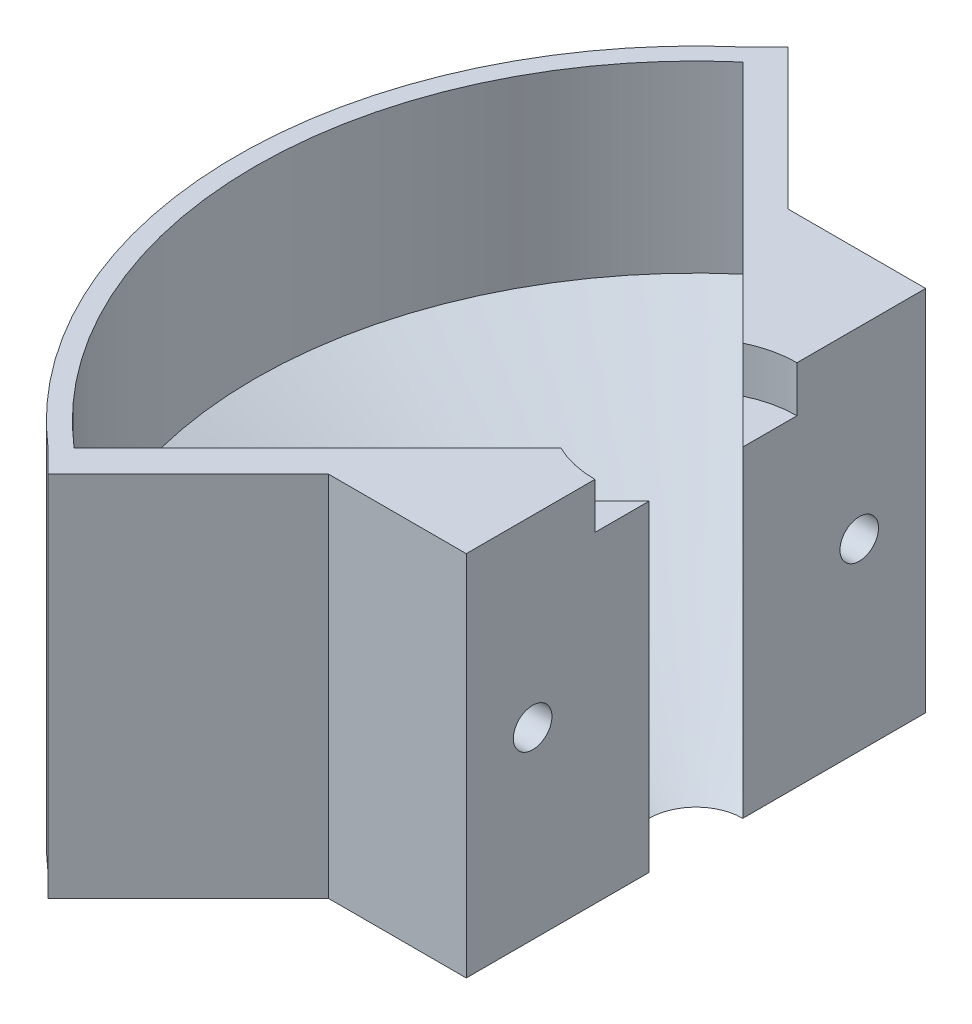
ISO-10303-21;
HEADER;
FILE_DESCRIPTION(('STEP AP214'),'2;1');
FILE_NAME('part.step','',(''),(''),'','','');
FILE_SCHEMA(('AUTOMOTIVE_DESIGN { 1 0 10303 214 1 1 1 1 }'));
ENDSEC;
DATA;
#1=APPLICATION_CONTEXT('core data for automotive mechanical design processes');
#2=APPLICATION_PROTOCOL_DEFINITION('international standard','automotive_design',2000,#1);
#3=PRODUCT_CONTEXT('',#1,'mechanical');
#4=PRODUCT('Part','Part','',(#3));
#5=PRODUCT_RELATED_PRODUCT_CATEGORY('part','',(#4));
#6=PRODUCT_DEFINITION_FORMATION('','',#4);
#7=PRODUCT_DEFINITION_CONTEXT('part definition',#1,'design');
#8=PRODUCT_DEFINITION('design','',#6,#7);
#9=PRODUCT_DEFINITION_SHAPE('','',#8);
#10=(LENGTH_UNIT() NAMED_UNIT(*) SI_UNIT(.MILLI.,.METRE.));
#11=(NAMED_UNIT(*) PLANE_ANGLE_UNIT() SI_UNIT($,.RADIAN.));
#12=(NAMED_UNIT(*) SI_UNIT($,.STERADIAN.) SOLID_ANGLE_UNIT());
#13=UNCERTAINTY_MEASURE_WITH_UNIT(LENGTH_MEASURE(1.E-05),#10,'distance_accuracy_value','');
#14=(GEOMETRIC_REPRESENTATION_CONTEXT(3) GLOBAL_UNCERTAINTY_ASSIGNED_CONTEXT((#13)) GLOBAL_UNIT_ASSIGNED_CONTEXT((#10,
#11,#12)) REPRESENTATION_CONTEXT('',''));
#15=CARTESIAN_POINT('',(0.,0.,0.));
#16=DIRECTION('',(0.,0.,1.));
#17=DIRECTION('',(1.,0.,0.));
#18=AXIS2_PLACEMENT_3D('',#15,#16,#17);
#19=CARTESIAN_POINT('',(0.,0.,0.));
#20=DIRECTION('',(0.,1.,0.));
#21=DIRECTION('',(0.,0.,1.));
#22=AXIS2_PLACEMENT_3D('',#19,#20,#21);
#23=PLANE('',#22);
#24=DIRECTION('',(-0.707106781186546,0.,-0.707106781186549));
#25=VECTOR('',#24,1.);
#26=CARTESIAN_POINT('',(6.34999999999996,0.,-6.34999999999993));
#27=LINE('',#26,#25);
#28=CARTESIAN_POINT('',(-19.05,0.,-31.75));
#29=VERTEX_POINT('',#28);
#30=CARTESIAN_POINT('',(-38.43434009506,0.,-51.13434009506));
#31=VERTEX_POINT('',#30);
#32=EDGE_CURVE('E295',#29,#31,#27,.T.);
#33=ORIENTED_EDGE('',*,*,#32,.F.);
#34=DIRECTION('',(1.,0.,0.));
#35=VECTOR('',#34,1.);
#36=CARTESIAN_POINT('',(0.,0.,-31.75));
#37=LINE('',#36,#35);
#38=CARTESIAN_POINT('',(1.10854532508269E-13,0.,-31.75));
#39=VERTEX_POINT('',#38);
#40=EDGE_CURVE('E267',#29,#39,#37,.T.);
#41=ORIENTED_EDGE('',*,*,#40,.T.);
#42=DIRECTION('',(0.,0.,1.));
#43=VECTOR('',#42,1.);
#44=CARTESIAN_POINT('',(0.,0.,0.));
#45=LINE('',#44,#43);
#46=CARTESIAN_POINT('',(0.,0.,-6.477));
#47=VERTEX_POINT('',#46);
#48=EDGE_CURVE('E228',#39,#47,#45,.T.);
#49=ORIENTED_EDGE('',*,*,#48,.T.);
#50=CARTESIAN_POINT('',(0.,0.,0.));
#51=DIRECTION('',(0.,-1.,0.));
#52=DIRECTION('',(0.,0.,-1.));
#53=AXIS2_PLACEMENT_3D('',#50,#51,#52);
#54=CIRCLE('',#53,6.477);
#55=CARTESIAN_POINT('',(0.,0.,6.477));
#56=VERTEX_POINT('',#55);
#57=EDGE_CURVE('E245',#56,#47,#54,.T.);
#58=ORIENTED_EDGE('',*,*,#57,.F.);
#59=DIRECTION('',(0.,0.,-1.));
#60=VECTOR('',#59,1.);
#61=CARTESIAN_POINT('',(0.,0.,0.));
#62=LINE('',#61,#60);
#63=CARTESIAN_POINT('',(1.10854532508269E-13,0.,31.75));
#64=VERTEX_POINT('',#63);
#65=EDGE_CURVE('E234',#64,#56,#62,.T.);
#66=ORIENTED_EDGE('',*,*,#65,.F.);
#67=DIRECTION('',(1.,0.,0.));
#68=VECTOR('',#67,1.);
#69=CARTESIAN_POINT('',(0.,0.,31.75));
#70=LINE('',#69,#68);
#71=CARTESIAN_POINT('',(-19.05,0.,31.75));
#72=VERTEX_POINT('',#71);
#73=EDGE_CURVE('E275',#72,#64,#70,.T.);
#74=ORIENTED_EDGE('',*,*,#73,.F.);
#75=DIRECTION('',(-0.707106781186551,0.,0.707106781186544));
#76=VECTOR('',#75,1.);
#77=CARTESIAN_POINT('',(6.35000000000011,0.,6.35000000000018));
#78=LINE('',#77,#76);
#79=CARTESIAN_POINT('',(-38.4343400950601,0.,51.1343400950599));
#80=VERTEX_POINT('',#79);
#81=EDGE_CURVE('E282',#72,#80,#78,.T.);
#82=ORIENTED_EDGE('',*,*,#81,.T.);
#83=DIRECTION('',(0.707106781186543,0.,0.707106781186552));
#84=VECTOR('',#83,1.);
#85=CARTESIAN_POINT('',(-44.7843400950603,0.,44.7843400950597));
#86=LINE('',#85,#84);
#87=CARTESIAN_POINT('',(-41.5458400950599,0.,48.0228400950601));
#88=VERTEX_POINT('',#87);
#89=EDGE_CURVE('E286',#88,#80,#86,.T.);
#90=ORIENTED_EDGE('',*,*,#89,.F.);
#91=CARTESIAN_POINT('',(0.,0.,0.));
#92=DIRECTION('',(0.,-1.,0.));
#93=DIRECTION('',(0.,0.,-1.));
#94=AXIS2_PLACEMENT_3D('',#91,#92,#93);
#95=CIRCLE('',#94,63.5);
#96=CARTESIAN_POINT('',(-41.5458400950599,0.,-48.0228400950601));
#97=VERTEX_POINT('',#96);
#98=EDGE_CURVE('E248',#88,#97,#95,.T.);
#99=ORIENTED_EDGE('',*,*,#98,.T.);
#100=DIRECTION('',(0.707106781186551,0.,-0.707106781186544));
#101=VECTOR('',#100,1.);
#102=CARTESIAN_POINT('',(-44.7843400950598,0.,-44.7843400950602));
#103=LINE('',#102,#101);
#104=EDGE_CURVE('E299',#97,#31,#103,.T.);
#105=ORIENTED_EDGE('',*,*,#104,.T.);
#106=EDGE_LOOP('',(#33,#41,#49,#58,#66,#74,#82,#90,#99,#105));
#107=FACE_BOUND('',#106,.T.);
#108=ADVANCED_FACE('F39',(#107),#23,.F.);
#109=CARTESIAN_POINT('',(0.,0.,0.));
#110=DIRECTION('',(0.,1.,0.));
#111=DIRECTION('',(0.,0.,1.));
#112=AXIS2_PLACEMENT_3D('',#109,#110,#111);
#113=CONICAL_SURFACE('',#112,6.477,1.13446401379632);
#114=CARTESIAN_POINT('',(0.,25.4058401392584,0.));
#115=DIRECTION('',(0.,-1.,0.));
#116=DIRECTION('',(0.,0.,-1.));
#117=AXIS2_PLACEMENT_3D('',#114,#115,#116);
#118=CIRCLE('',#117,60.96);
#119=CARTESIAN_POINT('',(-39.7449028172502,25.4058401392584,46.2219028172503));
#120=VERTEX_POINT('',#119);
#121=CARTESIAN_POINT('',(-39.7449028172502,25.4058401392584,-46.2219028172504));
#122=VERTEX_POINT('',#121);
#123=EDGE_CURVE('E242',#120,#122,#118,.T.);
#124=ORIENTED_EDGE('',*,*,#123,.F.);
#125=CARTESIAN_POINT('',(22.2185306471337,9.67716288061729,-15.7415306471337));
#126=CARTESIAN_POINT('',(21.7337843131844,9.36205880585059,-15.2567843131845));
#127=CARTESIAN_POINT('',(21.2489522906724,9.04721783375823,-14.7719522906724));
#128=CARTESIAN_POINT('',(20.2790528091265,8.41825083263591,-13.8020528091265));
#129=CARTESIAN_POINT('',(19.7939853486475,8.10412480806348,-13.3169853486475));
#130=CARTESIAN_POINT('',(18.8228502714689,7.47632351718254,-12.3458502714689));
#131=CARTESIAN_POINT('',(18.3367822270367,7.16264957371029,-11.8597822270367));
#132=CARTESIAN_POINT('',(17.3642613779835,6.53650532118089,-10.8872613779835));
#133=CARTESIAN_POINT('',(16.8778085752714,6.22403500619693,-10.4008085752715));
#134=CARTESIAN_POINT('',(15.834231981346,5.55579562103315,-9.35723198134598));
#135=CARTESIAN_POINT('',(15.2770279164825,5.2002771442845,-8.8000279164825));
#136=CARTESIAN_POINT('',(14.161626219843,4.49232873829381,-7.68462621984304));
#137=CARTESIAN_POINT('',(13.603428571678,4.13989886057682,-7.12642857167796));
#138=CARTESIAN_POINT('',(12.7653961675281,3.61514032547954,-6.28839616752813));
#139=CARTESIAN_POINT('',(12.4861311131338,3.44099276528883,-6.00913111313377));
#140=CARTESIAN_POINT('',(11.927117307022,3.09425815849328,-5.45011730702203));
#141=CARTESIAN_POINT('',(11.6473685563993,2.92167110836224,-5.17036855639934));
#142=CARTESIAN_POINT('',(11.0872588734185,2.5785309350132,-4.61025887341849));
#143=CARTESIAN_POINT('',(10.8068979626271,2.40797774146662,-4.32989796262711));
#144=CARTESIAN_POINT('',(10.2453582682314,2.06957155299808,-3.76835826823144));
#145=CARTESIAN_POINT('',(9.96417947861359,1.90171857798934,-3.48717947861359));
#146=CARTESIAN_POINT('',(9.43213700430225,1.58822251276637,-2.95513700430225));
#147=CARTESIAN_POINT('',(9.18138838161661,1.442189580832,-2.70438838161661));
#148=CARTESIAN_POINT('',(8.67875578548658,1.15409207819818,-2.20175578548658));
#149=CARTESIAN_POINT('',(8.42687183720714,1.01202742003787,-1.94987183720713));
#150=CARTESIAN_POINT('',(7.92063748871871,0.732903513769204,-1.4436374887187));
#151=CARTESIAN_POINT('',(7.66628140160357,0.595864824933706,-1.18928140160356));
#152=CARTESIAN_POINT('',(7.15547556796822,0.329744557820167,-0.67847556796821));
#153=CARTESIAN_POINT('',(6.89902586493743,0.200662814731159,-0.422025864937417));
#154=CARTESIAN_POINT('',(6.51878119456729,0.0190416438477024,-0.0417811945672852));
#155=CARTESIAN_POINT('',(6.39608193390751,-0.0380803780612059,0.0809180660925016));
#156=CARTESIAN_POINT('',(6.14995084788253,-0.14906562916283,0.327049152117482));
#157=CARTESIAN_POINT('',(6.0265190468542,-0.202928965959242,0.450480953145808));
#158=CARTESIAN_POINT('',(5.77877611059957,-0.306721804471863,0.698223889400437));
#159=CARTESIAN_POINT('',(5.65446468420135,-0.356649930131262,0.822535315798663));
#160=CARTESIAN_POINT('',(5.40492927003386,-0.451692183262391,1.07207072996615));
#161=CARTESIAN_POINT('',(5.27970524720857,-0.496806124751976,1.19729475279144));
#162=CARTESIAN_POINT('',(4.9041750825522,-0.622878424826763,1.57282491744782));
#163=CARTESIAN_POINT('',(4.65233766127113,-0.695294767701955,1.82466233872888));
#164=CARTESIAN_POINT('',(4.27202091008192,-0.779877351723351,2.20497908991809));
#165=CARTESIAN_POINT('',(4.14486520300339,-0.804060450996301,2.33213479699663));
#166=CARTESIAN_POINT('',(3.88986284151042,-0.843383461244161,2.5871371584896));
#167=CARTESIAN_POINT('',(3.76201628489703,-0.858524620076481,2.71498371510298));
#168=CARTESIAN_POINT('',(3.46622173643085,-0.882153535188674,3.01077826356917));
#169=CARTESIAN_POINT('',(3.2981247431039,-0.887125150509718,3.17887525689612));
#170=CARTESIAN_POINT('',(2.96211957868032,-0.879719678600552,3.5148804213197));
#171=CARTESIAN_POINT('',(2.79421142403984,-0.867341181382737,3.68278857596018));
#172=CARTESIAN_POINT('',(2.45898595132387,-0.826319272528589,4.01801404867615));
#173=CARTESIAN_POINT('',(2.29167123619301,-0.797634415617515,4.18532876380701));
#174=CARTESIAN_POINT('',(1.95856281756555,-0.726224465865842,4.51843718243447));
#175=CARTESIAN_POINT('',(1.79276929077618,-0.68349776257357,4.68423070922384));
#176=CARTESIAN_POINT('',(1.45990781351204,-0.58575216763616,5.01709218648798));
#177=CARTESIAN_POINT('',(1.29287094809667,-0.53052515720236,5.18412905190336));
#178=CARTESIAN_POINT('',(0.960493629975765,-0.410800213728523,5.51650637002426));
#179=CARTESIAN_POINT('',(0.795153144495257,-0.346302460167047,5.68184685550477));
#180=CARTESIAN_POINT('',(0.46600201922674,-0.210160940631327,6.01099798077328));
#181=CARTESIAN_POINT('',(0.30219104888289,-0.138518759712606,6.17480895111713));
#182=CARTESIAN_POINT('',(0.0574312354014305,-0.0269119644369387,6.41956876459859));
#183=CARTESIAN_POINT('',(-0.0239953909176357,0.0109806224410036,6.50099539091766));
#184=CARTESIAN_POINT('',(-0.186559095418323,0.0879876698378885,6.66355909541835));
#185=CARTESIAN_POINT('',(-0.267696174855889,0.12710212504963,6.74469617485591));
#186=CARTESIAN_POINT('',(-0.504489189724358,0.243008311240306,6.98148918972438));
#187=CARTESIAN_POINT('',(-0.659790891518045,0.321247874622927,7.13679089151807));
#188=CARTESIAN_POINT('',(-0.969589430218108,0.480858272288594,7.44658943021813));
#189=CARTESIAN_POINT('',(-1.12408624065079,0.562229208836623,7.60108624065082));
#190=CARTESIAN_POINT('',(-1.43242609434515,0.727479115220677,7.90942609434518));
#191=CARTESIAN_POINT('',(-1.58626906313016,0.811358362463788,8.06326906313019));
#192=CARTESIAN_POINT('',(-1.89339719757366,0.981137436946703,8.37039719757369));
#193=CARTESIAN_POINT('',(-2.04668235706383,1.06703728645261,8.52368235706386));
#194=CARTESIAN_POINT('',(-2.50595370379375,1.32725045864989,8.98295370379378));
#195=CARTESIAN_POINT('',(-2.8112445621671,1.50401714260153,9.28824456216713));
#196=CARTESIAN_POINT('',(-3.42051670784652,1.86200767199346,9.89751670784655));
#197=CARTESIAN_POINT('',(-3.72449796951653,2.04323160422508,10.2014979695166));
#198=CARTESIAN_POINT('',(-4.3316899189757,2.40897190067935,10.8086899189757));
#199=CARTESIAN_POINT('',(-4.63490001196786,2.59349023705738,11.1119000119679));
#200=CARTESIAN_POINT('',(-5.24060829747395,2.96486178559192,11.717608297474));
#201=CARTESIAN_POINT('',(-5.54310647980282,3.15171503091475,12.0201064798029));
#202=CARTESIAN_POINT('',(-6.14748242199471,3.52713178953416,12.6244824219948));
#203=CARTESIAN_POINT('',(-6.44936031627085,3.71569487043352,12.9263603162709));
#204=CARTESIAN_POINT('',(-7.0526907251003,4.09417662104561,13.5296907251003));
#205=CARTESIAN_POINT('',(-7.35414323947282,4.28409529133428,13.8311432394729));
#206=CARTESIAN_POINT('',(-8.25452965918542,4.85323702628278,14.7315296591855));
#207=CARTESIAN_POINT('',(-8.85297166247992,5.23401601623761,15.32997166248));
#208=CARTESIAN_POINT('',(-10.0490333942426,5.99828382373224,16.5260333942426));
#209=CARTESIAN_POINT('',(-10.6466530689204,6.38177280932843,17.1236530689204));
#210=CARTESIAN_POINT('',(-11.8410101757164,7.15041885951564,18.3180101757164));
#211=CARTESIAN_POINT('',(-12.4377478932615,7.53557503742941,18.9147478932616));
#212=CARTESIAN_POINT('',(-13.630783791836,8.30720420989987,20.1077837918361));
#213=CARTESIAN_POINT('',(-14.2270819808565,8.69367717975958,20.7040819808566));
#214=CARTESIAN_POINT('',(-15.9258952834684,9.79637914220122,22.4028952834685));
#215=CARTESIAN_POINT('',(-17.0280306271886,10.5137780361381,23.5050306271886));
#216=CARTESIAN_POINT('',(-19.2316552361762,11.9505821597325,25.7086552361763));
#217=CARTESIAN_POINT('',(-20.3331444972632,12.6699874022025,26.8101444972633));
#218=CARTESIAN_POINT('',(-22.5358562090287,14.110230920228,29.0128562090287));
#219=CARTESIAN_POINT('',(-23.637078594346,14.8310693956823,30.1140785943461));
#220=CARTESIAN_POINT('',(-25.8392210437084,16.2736617357618,32.3162210437085));
#221=CARTESIAN_POINT('',(-26.9401411082972,16.9954155987273,33.4171411082972));
#222=CARTESIAN_POINT('',(-30.2462168402928,19.1640334667112,36.7232168402929));
#223=CARTESIAN_POINT('',(-32.4510521952293,20.6118740225196,38.9280521952294));
#224=CARTESIAN_POINT('',(-36.860152139453,23.5089459097632,43.3371521394531));
#225=CARTESIAN_POINT('',(-39.0644167489798,24.9581771796156,45.5414167489799));
#226=CARTESIAN_POINT('',(-43.3293073547119,27.7632805365026,49.806307354712));
#227=CARTESIAN_POINT('',(-45.3899523155634,29.1190949576445,51.8669523155635));
#228=CARTESIAN_POINT('',(-49.5110915881632,31.8312872437933,55.9880915881634));
#229=CARTESIAN_POINT('',(-51.5715858974255,33.1876651163548,58.0485858974257));
#230=CARTESIAN_POINT('',(-55.6891490831567,35.8986349701795,62.1661490831568));
#231=CARTESIAN_POINT('',(-57.7462181627681,37.2532263343772,64.2232181627682));
#232=CARTESIAN_POINT('',(-61.860232360352,39.9626798216561,68.3372323603522));
#233=CARTESIAN_POINT('',(-63.9171774796504,41.3175419407107,70.3941774796506));
#234=CARTESIAN_POINT('',(-65.9740905347648,42.6725013844159,72.451090534765));
#235=B_SPLINE_CURVE_WITH_KNOTS('',3,(#125,#126,#127,#128,#129,#130,#131,#132,#133,#134,#135,
#136,#137,#138,#139,#140,#141,#142,#143,#144,#145,#146,#147,#148,#149,#150,#151,#152,#153,#154,
#155,#156,#157,#158,#159,#160,#161,#162,#163,#164,#165,#166,#167,#168,#169,#170,#171,#172,#173,
#174,#175,#176,#177,#178,#179,#180,#181,#182,#183,#184,#185,#186,#187,#188,#189,#190,#191,#192,
#193,#194,#195,#196,#197,#198,#199,#200,#201,#202,#203,#204,#205,#206,#207,#208,#209,#210,#211,
#212,#213,#214,#215,#216,#217,#218,#219,#220,#221,#222,#223,#224,#225,#226,#227,#228,#229,#230,
#231,#232,#233,#234),.UNSPECIFIED.,.F.,.F.,(4,2,2,2,2,2,2,2,2,2,2,2,2,2,2,2,2,2,2,2,2,2,2,2,2,2,
2,2,2,2,2,2,2,2,2,2,2,2,2,2,2,2,2,2,2,2,2,2,2,2,2,2,2,2,4),(0.,2.26345723044833,
4.52692853458373,6.79369645594403,9.06045320113847,11.6539250782194,14.2474401384273,
15.5423306588726,16.8372182526029,18.1320609399129,19.4269131718843,20.5774089246282,
21.7278793003748,22.8826243394744,24.037345452479,24.5853692946725,25.1333750309086,
25.6815715502965,26.2297892400176,27.3188076570233,27.8629499758512,28.4070171814836,
29.1196950459244,29.8324308307514,30.5469863016951,31.2616237532308,31.9891713975376,
32.7167049586559,33.4440774674887,33.807758889203,34.1714387314818,34.8708535615927,
35.5702912527433,36.2698065865231,36.9693296322521,38.3688808864512,39.7684594142579,
41.1689059134475,42.5693723280062,43.9694939452173,45.3696161573316,48.1537276698885,
50.9380133772276,53.7209658503926,56.5038664123469,61.6513476855413,66.7988619062516,
71.9471530380146,77.0954348496736,87.4089960353167,97.7221198496211,107.364564079336,
117.007142058906,126.634283747688,136.261291581588),.UNSPECIFIED.);
#236=EDGE_CURVE('E186',#56,#120,#235,.T.);
#237=ORIENTED_EDGE('',*,*,#236,.F.);
#238=ORIENTED_EDGE('',*,*,#57,.T.);
#239=CARTESIAN_POINT('',(22.2185306471337,9.6771628806173,15.7415306471338));
#240=CARTESIAN_POINT('',(21.7337843131844,9.3620588058506,15.2567843131845));
#241=CARTESIAN_POINT('',(21.2489522906724,9.04721783375824,14.7719522906724));
#242=CARTESIAN_POINT('',(20.2790528091265,8.41825083263592,13.8020528091265));
#243=CARTESIAN_POINT('',(19.7939853486475,8.10412480806348,13.3169853486475));
#244=CARTESIAN_POINT('',(18.8228502714689,7.47632351718254,12.3458502714689));
#245=CARTESIAN_POINT('',(18.3367822270367,7.16264957371029,11.8597822270367));
#246=CARTESIAN_POINT('',(17.3642613779835,6.5365053211809,10.8872613779836));
#247=CARTESIAN_POINT('',(16.8778085752714,6.22403500619693,10.4008085752715));
#248=CARTESIAN_POINT('',(15.834231981346,5.55579562103315,9.357231981346));
#249=CARTESIAN_POINT('',(15.2770279164825,5.2002771442845,8.80002791648252));
#250=CARTESIAN_POINT('',(14.161626219843,4.49232873829381,7.68462621984306));
#251=CARTESIAN_POINT('',(13.6034285716779,4.13989886057682,7.12642857167797));
#252=CARTESIAN_POINT('',(12.7653961675281,3.61514032547954,6.28839616752814));
#253=CARTESIAN_POINT('',(12.4861311131338,3.44099276528883,6.00913111313378));
#254=CARTESIAN_POINT('',(11.927117307022,3.09425815849328,5.45011730702204));
#255=CARTESIAN_POINT('',(11.6473685563993,2.92167110836224,5.17036855639935));
#256=CARTESIAN_POINT('',(11.0872588734185,2.57853093501319,4.61025887341849));
#257=CARTESIAN_POINT('',(10.8068979626271,2.40797774146661,4.32989796262712));
#258=CARTESIAN_POINT('',(10.2453582682314,2.06957155299807,3.76835826823144));
#259=CARTESIAN_POINT('',(9.96417947861358,1.90171857798933,3.4871794786136));
#260=CARTESIAN_POINT('',(9.43213700430224,1.58822251276637,2.95513700430226));
#261=CARTESIAN_POINT('',(9.1813883816166,1.44218958083199,2.70438838161661));
#262=CARTESIAN_POINT('',(8.67875578548658,1.15409207819817,2.20175578548659));
#263=CARTESIAN_POINT('',(8.42687183720713,1.01202742003787,1.94987183720714));
#264=CARTESIAN_POINT('',(7.9206374887187,0.732903513769201,1.44363748871871));
#265=CARTESIAN_POINT('',(7.66628140160356,0.595864824933703,1.18928140160357));
#266=CARTESIAN_POINT('',(7.15547556796821,0.329744557820164,0.678475567968214));
#267=CARTESIAN_POINT('',(6.89902586493742,0.200662814731155,0.422025864937421));
#268=CARTESIAN_POINT('',(6.51878119456729,0.0190416438476983,0.0417811945672876));
#269=CARTESIAN_POINT('',(6.3960819339075,-0.0380803780612098,-0.0809180660924995));
#270=CARTESIAN_POINT('',(6.14995084788252,-0.149065629162833,-0.327049152117479));
#271=CARTESIAN_POINT('',(6.0265190468542,-0.202928965959245,-0.450480953145804));
#272=CARTESIAN_POINT('',(5.77877611059957,-0.306721804471866,-0.698223889400433));
#273=CARTESIAN_POINT('',(5.65446468420134,-0.356649930131265,-0.822535315798659));
#274=CARTESIAN_POINT('',(5.40492927003386,-0.451692183262394,-1.07207072996614));
#275=CARTESIAN_POINT('',(5.27970524720857,-0.496806124751979,-1.19729475279144));
#276=CARTESIAN_POINT('',(4.90417508255219,-0.622878424826767,-1.57282491744781));
#277=CARTESIAN_POINT('',(4.65233766127113,-0.695294767701957,-1.82466233872888));
#278=CARTESIAN_POINT('',(4.27202091008192,-0.779877351723353,-2.20497908991809));
#279=CARTESIAN_POINT('',(4.14486520300338,-0.804060450996304,-2.33213479699662));
#280=CARTESIAN_POINT('',(3.88986284151041,-0.843383461244163,-2.58713715848959));
#281=CARTESIAN_POINT('',(3.76201628489702,-0.858524620076483,-2.71498371510298));
#282=CARTESIAN_POINT('',(3.46622173643084,-0.882153535188676,-3.01077826356917));
#283=CARTESIAN_POINT('',(3.29812474310389,-0.88712515050972,-3.17887525689612));
#284=CARTESIAN_POINT('',(2.96211957868031,-0.879719678600553,-3.5148804213197));
#285=CARTESIAN_POINT('',(2.79421142403983,-0.867341181382738,-3.68278857596019));
#286=CARTESIAN_POINT('',(2.45898595132386,-0.82631927252859,-4.01801404867616));
#287=CARTESIAN_POINT('',(2.291671236193,-0.797634415617515,-4.18532876380701));
#288=CARTESIAN_POINT('',(1.95856281756554,-0.726224465865842,-4.51843718243448));
#289=CARTESIAN_POINT('',(1.79276929077617,-0.683497762573569,-4.68423070922384));
#290=CARTESIAN_POINT('',(1.45990781351203,-0.585752167636158,-5.01709218648798));
#291=CARTESIAN_POINT('',(1.29287094809665,-0.530525157202358,-5.18412905190336));
#292=CARTESIAN_POINT('',(0.960493629975753,-0.41080021372852,-5.51650637002427));
#293=CARTESIAN_POINT('',(0.795153144495244,-0.346302460167044,-5.68184685550477));
#294=CARTESIAN_POINT('',(0.466002019226727,-0.210160940631323,-6.01099798077329));
#295=CARTESIAN_POINT('',(0.302191048882876,-0.138518759712601,-6.17480895111715));
#296=CARTESIAN_POINT('',(0.0574312354014154,-0.0269119644369328,-6.41956876459861));
#297=CARTESIAN_POINT('',(-0.0239953909176508,0.0109806224410097,-6.50099539091767));
#298=CARTESIAN_POINT('',(-0.186559095418338,0.087987669837895,-6.66355909541836));
#299=CARTESIAN_POINT('',(-0.267696174855905,0.127102125049637,-6.74469617485593));
#300=CARTESIAN_POINT('',(-0.504489189724374,0.243008311240313,-6.9814891897244));
#301=CARTESIAN_POINT('',(-0.659790891518063,0.321247874622935,-7.13679089151809));
#302=CARTESIAN_POINT('',(-0.969589430218126,0.480858272288603,-7.44658943021815));
#303=CARTESIAN_POINT('',(-1.12408624065081,0.562229208836632,-7.60108624065083));
#304=CARTESIAN_POINT('',(-1.43242609434517,0.727479115220687,-7.9094260943452));
#305=CARTESIAN_POINT('',(-1.58626906313018,0.811358362463798,-8.06326906313021));
#306=CARTESIAN_POINT('',(-1.89339719757368,0.981137436946713,-8.37039719757371));
#307=CARTESIAN_POINT('',(-2.04668235706385,1.06703728645262,-8.52368235706388));
#308=CARTESIAN_POINT('',(-2.50595370379377,1.3272504586499,-8.9829537037938));
#309=CARTESIAN_POINT('',(-2.81124456216712,1.50401714260155,-9.28824456216715));
#310=CARTESIAN_POINT('',(-3.42051670784654,1.86200767199347,-9.89751670784657));
#311=CARTESIAN_POINT('',(-3.72449796951655,2.04323160422509,-10.2014979695166));
#312=CARTESIAN_POINT('',(-4.33168991897572,2.40897190067936,-10.8086899189758));
#313=CARTESIAN_POINT('',(-4.63490001196789,2.59349023705739,-11.1119000119679));
#314=CARTESIAN_POINT('',(-5.24060829747398,2.96486178559194,-11.717608297474));
#315=CARTESIAN_POINT('',(-5.54310647980284,3.15171503091477,-12.0201064798029));
#316=CARTESIAN_POINT('',(-6.14748242199474,3.52713178953418,-12.6244824219948));
#317=CARTESIAN_POINT('',(-6.44936031627087,3.71569487043354,-12.9263603162709));
#318=CARTESIAN_POINT('',(-7.05269072510032,4.09417662104563,-13.5296907251004));
#319=CARTESIAN_POINT('',(-7.35414323947285,4.2840952913343,-13.8311432394729));
#320=CARTESIAN_POINT('',(-8.25452965918545,4.8532370262828,-14.7315296591855));
#321=CARTESIAN_POINT('',(-8.85297166247995,5.23401601623764,-15.32997166248));
#322=CARTESIAN_POINT('',(-10.0490333942426,5.99828382373227,-16.5260333942427));
#323=CARTESIAN_POINT('',(-10.6466530689204,6.38177280932846,-17.1236530689205));
#324=CARTESIAN_POINT('',(-11.8410101757164,7.15041885951567,-18.3180101757165));
#325=CARTESIAN_POINT('',(-12.4377478932616,7.53557503742945,-18.9147478932616));
#326=CARTESIAN_POINT('',(-13.6307837918361,8.3072042098999,-20.1077837918361));
#327=CARTESIAN_POINT('',(-14.2270819808566,8.69367717975961,-20.7040819808566));
#328=CARTESIAN_POINT('',(-15.9258952834685,9.79637914220125,-22.4028952834685));
#329=CARTESIAN_POINT('',(-17.0280306271886,10.5137780361382,-23.5050306271887));
#330=CARTESIAN_POINT('',(-19.2316552361762,11.9505821597325,-25.7086552361763));
#331=CARTESIAN_POINT('',(-20.3331444972632,12.6699874022026,-26.8101444972633));
#332=CARTESIAN_POINT('',(-22.5358562090287,14.110230920228,-29.0128562090288));
#333=CARTESIAN_POINT('',(-23.637078594346,14.8310693956823,-30.1140785943462));
#334=CARTESIAN_POINT('',(-25.8392210437084,16.2736617357618,-32.3162210437086));
#335=CARTESIAN_POINT('',(-26.9401411082972,16.9954155987274,-33.4171411082973));
#336=CARTESIAN_POINT('',(-30.2462168402928,19.1640334667113,-36.7232168402929));
#337=CARTESIAN_POINT('',(-32.4510521952293,20.6118740225196,-38.9280521952295));
#338=CARTESIAN_POINT('',(-36.860152139453,23.5089459097633,-43.3371521394532));
#339=CARTESIAN_POINT('',(-39.0644167489798,24.9581771796157,-45.54141674898));
#340=CARTESIAN_POINT('',(-43.3293073547119,27.7632805365026,-49.8063073547121));
#341=CARTESIAN_POINT('',(-45.3899523155634,29.1190949576445,-51.8669523155636));
#342=CARTESIAN_POINT('',(-49.5110915881632,31.8312872437933,-55.9880915881634));
#343=CARTESIAN_POINT('',(-51.5715858974255,33.1876651163548,-58.0485858974257));
#344=CARTESIAN_POINT('',(-55.6891490831566,35.8986349701796,-62.1661490831569));
#345=CARTESIAN_POINT('',(-57.746218162768,37.2532263343772,-64.2232181627683));
#346=CARTESIAN_POINT('',(-61.860232360352,39.9626798216561,-68.3372323603522));
#347=CARTESIAN_POINT('',(-63.9171774796504,41.3175419407108,-70.3941774796506));
#348=CARTESIAN_POINT('',(-65.9740905347648,42.6725013844159,-72.451090534765));
#349=B_SPLINE_CURVE_WITH_KNOTS('',3,(#239,#240,#241,#242,#243,#244,#245,#246,#247,#248,#249,
#250,#251,#252,#253,#254,#255,#256,#257,#258,#259,#260,#261,#262,#263,#264,#265,#266,#267,#268,
#269,#270,#271,#272,#273,#274,#275,#276,#277,#278,#279,#280,#281,#282,#283,#284,#285,#286,#287,
#288,#289,#290,#291,#292,#293,#294,#295,#296,#297,#298,#299,#300,#301,#302,#303,#304,#305,#306,
#307,#308,#309,#310,#311,#312,#313,#314,#315,#316,#317,#318,#319,#320,#321,#322,#323,#324,#325,
#326,#327,#328,#329,#330,#331,#332,#333,#334,#335,#336,#337,#338,#339,#340,#341,#342,#343,#344,
#345,#346,#347,#348),.UNSPECIFIED.,.F.,.F.,(4,2,2,2,2,2,2,2,2,2,2,2,2,2,2,2,2,2,2,2,2,2,2,2,2,2,
2,2,2,2,2,2,2,2,2,2,2,2,2,2,2,2,2,2,2,2,2,2,2,2,2,2,2,2,4),(0.,2.26345723044833,
4.52692853458373,6.79369645594404,9.06045320113848,11.6539250782194,14.2474401384273,
15.5423306588726,16.837218252603,18.132060939913,19.4269131718844,20.5774089246282,
21.7278793003748,22.8826243394744,24.037345452479,24.5853692946725,25.1333750309087,
25.6815715502966,26.2297892400177,27.3188076570233,27.8629499758512,28.4070171814836,
29.1196950459244,29.8324308307514,30.5469863016951,31.2616237532308,31.9891713975376,
32.716704958656,33.4440774674887,33.807758889203,34.1714387314819,34.8708535615928,
35.5702912527434,36.2698065865231,36.9693296322521,38.3688808864513,39.768459414258,
41.1689059134476,42.5693723280063,43.9694939452173,45.3696161573316,48.1537276698886,
50.9380133772277,53.7209658503927,56.503866412347,61.6513476855414,66.7988619062516,
71.9471530380147,77.0954348496737,87.4089960353168,97.7221198496212,107.364564079336,
117.007142058906,126.634283747688,136.261291581588),.UNSPECIFIED.);
#350=EDGE_CURVE('E222',#47,#122,#349,.T.);
#351=ORIENTED_EDGE('',*,*,#350,.T.);
#352=EDGE_LOOP('',(#124,#237,#238,#351));
#353=FACE_BOUND('',#352,.T.);
#354=ADVANCED_FACE('F197',(#353),#113,.F.);
#355=CARTESIAN_POINT('',(0.,0.,0.));
#356=DIRECTION('',(0.,-1.,0.));
#357=DIRECTION('',(0.,0.,-1.));
#358=AXIS2_PLACEMENT_3D('',#355,#356,#357);
#359=CYLINDRICAL_SURFACE('',#358,63.5);
#360=DIRECTION('',(0.,-1.,0.));
#361=VECTOR('',#360,1.);
#362=CARTESIAN_POINT('',(-41.5458400950599,50.801,48.0228400950601));
#363=LINE('',#362,#361);
#364=CARTESIAN_POINT('',(-41.5458400950599,50.8,48.0228400950601));
#365=VERTEX_POINT('',#364);
#366=EDGE_CURVE('E272',#365,#88,#363,.T.);
#367=ORIENTED_EDGE('',*,*,#366,.F.);
#368=CARTESIAN_POINT('',(0.,50.8,0.));
#369=DIRECTION('',(0.,-1.,0.));
#370=DIRECTION('',(0.,0.,-1.));
#371=AXIS2_PLACEMENT_3D('',#368,#369,#370);
#372=CIRCLE('',#371,63.5);
#373=CARTESIAN_POINT('',(-41.5458400950599,50.8,-48.0228400950601));
#374=VERTEX_POINT('',#373);
#375=EDGE_CURVE('E237',#365,#374,#372,.T.);
#376=ORIENTED_EDGE('',*,*,#375,.T.);
#377=DIRECTION('',(0.,-1.,0.));
#378=VECTOR('',#377,1.);
#379=CARTESIAN_POINT('',(-41.5458400950599,50.801,-48.0228400950601));
#380=LINE('',#379,#378);
#381=EDGE_CURVE('E266',#374,#97,#380,.T.);
#382=ORIENTED_EDGE('',*,*,#381,.T.);
#383=ORIENTED_EDGE('',*,*,#98,.F.);
#384=EDGE_LOOP('',(#367,#376,#382,#383));
#385=FACE_BOUND('',#384,.T.);
#386=ADVANCED_FACE('F388',(#385),#359,.T.);
#387=CARTESIAN_POINT('',(0.,0.,0.));
#388=DIRECTION('',(0.,-1.,0.));
#389=DIRECTION('',(0.,0.,-1.));
#390=AXIS2_PLACEMENT_3D('',#387,#388,#389);
#391=CYLINDRICAL_SURFACE('',#390,60.96);
#392=DIRECTION('',(0.,-1.,0.));
#393=VECTOR('',#392,1.);
#394=CARTESIAN_POINT('',(-39.7449028172502,0.,46.2219028172503));
#395=LINE('',#394,#393);
#396=CARTESIAN_POINT('',(-39.7449028172502,50.8,46.2219028172504));
#397=VERTEX_POINT('',#396);
#398=EDGE_CURVE('E256',#397,#120,#395,.T.);
#399=ORIENTED_EDGE('',*,*,#398,.T.);
#400=ORIENTED_EDGE('',*,*,#123,.T.);
#401=DIRECTION('',(0.,-1.,0.));
#402=VECTOR('',#401,1.);
#403=CARTESIAN_POINT('',(-39.7449028172502,0.,-46.2219028172504));
#404=LINE('',#403,#402);
#405=CARTESIAN_POINT('',(-39.7449028172502,50.8,-46.2219028172504));
#406=VERTEX_POINT('',#405);
#407=EDGE_CURVE('E179',#406,#122,#404,.T.);
#408=ORIENTED_EDGE('',*,*,#407,.F.);
#409=CARTESIAN_POINT('',(0.,50.8,0.));
#410=DIRECTION('',(0.,-1.,0.));
#411=DIRECTION('',(0.,0.,-1.));
#412=AXIS2_PLACEMENT_3D('',#409,#410,#411);
#413=CIRCLE('',#412,60.96);
#414=EDGE_CURVE('E239',#397,#406,#413,.T.);
#415=ORIENTED_EDGE('',*,*,#414,.F.);
#416=EDGE_LOOP('',(#399,#400,#408,#415));
#417=FACE_BOUND('',#416,.T.);
#418=ADVANCED_FACE('F263',(#417),#391,.F.);
#419=CARTESIAN_POINT('',(0.,0.,0.));
#420=DIRECTION('',(-1.,0.,0.));
#421=DIRECTION('',(0.,0.,1.));
#422=AXIS2_PLACEMENT_3D('',#419,#420,#421);
#423=PLANE('',#422);
#424=CARTESIAN_POINT('',(0.,25.4,-22.5749999999997));
#425=DIRECTION('',(1.,0.,0.));
#426=DIRECTION('',(0.,0.,-1.));
#427=AXIS2_PLACEMENT_3D('',#424,#425,#426);
#428=CIRCLE('',#427,2.665);
#429=CARTESIAN_POINT('',(0.,25.4,-25.2399999999997));
#430=VERTEX_POINT('',#429);
#431=EDGE_CURVE('E319',#430,#430,#428,.T.);
#432=ORIENTED_EDGE('',*,*,#431,.F.);
#433=EDGE_LOOP('',(#432));
#434=FACE_BOUND('',#433,.T.);
#435=DIRECTION('',(0.,0.,1.));
#436=VECTOR('',#435,1.);
#437=CARTESIAN_POINT('',(0.,50.8,0.));
#438=LINE('',#437,#436);
#439=CARTESIAN_POINT('',(1.10854532508269E-13,50.8,-31.75));
#440=VERTEX_POINT('',#439);
#441=CARTESIAN_POINT('',(0.,50.8,-13.97));
#442=VERTEX_POINT('',#441);
#443=EDGE_CURVE('E195',#440,#442,#438,.T.);
#444=ORIENTED_EDGE('',*,*,#443,.T.);
#445=DIRECTION('',(0.,1.,0.));
#446=VECTOR('',#445,1.);
#447=CARTESIAN_POINT('',(0.,44.45,-13.97));
#448=LINE('',#447,#446);
#449=CARTESIAN_POINT('',(0.,44.45,-13.97));
#450=VERTEX_POINT('',#449);
#451=EDGE_CURVE('E53',#442,#450,#448,.F.);
#452=ORIENTED_EDGE('',*,*,#451,.T.);
#453=DIRECTION('',(0.,0.,-1.));
#454=VECTOR('',#453,1.);
#455=CARTESIAN_POINT('',(0.,44.45,0.));
#456=LINE('',#455,#454);
#457=CARTESIAN_POINT('',(0.,44.45,-6.477));
#458=VERTEX_POINT('',#457);
#459=EDGE_CURVE('E307',#458,#450,#456,.T.);
#460=ORIENTED_EDGE('',*,*,#459,.F.);
#461=DIRECTION('',(0.,-1.,0.));
#462=VECTOR('',#461,1.);
#463=CARTESIAN_POINT('',(0.,50.8,-6.477));
#464=LINE('',#463,#462);
#465=EDGE_CURVE('E230',#458,#47,#464,.T.);
#466=ORIENTED_EDGE('',*,*,#465,.T.);
#467=ORIENTED_EDGE('',*,*,#48,.F.);
#468=DIRECTION('',(0.,-1.,0.));
#469=VECTOR('',#468,1.);
#470=CARTESIAN_POINT('',(1.10854532508269E-13,50.8,-31.75));
#471=LINE('',#470,#469);
#472=EDGE_CURVE('E229',#440,#39,#471,.T.);
#473=ORIENTED_EDGE('',*,*,#472,.F.);
#474=EDGE_LOOP('',(#444,#452,#460,#466,#467,#473));
#475=FACE_BOUND('',#474,.T.);
#476=ADVANCED_FACE('F219',(#434,#475),#423,.F.);
#477=CARTESIAN_POINT('',(0.,0.,0.));
#478=DIRECTION('',(1.,0.,0.));
#479=DIRECTION('',(0.,0.,-1.));
#480=AXIS2_PLACEMENT_3D('',#477,#478,#479);
#481=PLANE('',#480);
#482=CARTESIAN_POINT('',(0.,25.4,22.5750000000003));
#483=DIRECTION('',(1.,0.,0.));
#484=DIRECTION('',(0.,0.,-1.));
#485=AXIS2_PLACEMENT_3D('',#482,#483,#484);
#486=CIRCLE('',#485,2.665);
#487=CARTESIAN_POINT('',(0.,25.4,19.9100000000003));
#488=VERTEX_POINT('',#487);
#489=EDGE_CURVE('E313',#488,#488,#486,.T.);
#490=ORIENTED_EDGE('',*,*,#489,.F.);
#491=EDGE_LOOP('',(#490));
#492=FACE_BOUND('',#491,.T.);
#493=DIRECTION('',(0.,1.,0.));
#494=VECTOR('',#493,1.);
#495=CARTESIAN_POINT('',(0.,44.45,13.97));
#496=LINE('',#495,#494);
#497=CARTESIAN_POINT('',(0.,50.8,13.97));
#498=VERTEX_POINT('',#497);
#499=CARTESIAN_POINT('',(0.,44.45,13.97));
#500=VERTEX_POINT('',#499);
#501=EDGE_CURVE('E156',#498,#500,#496,.F.);
#502=ORIENTED_EDGE('',*,*,#501,.F.);
#503=DIRECTION('',(0.,0.,1.));
#504=VECTOR('',#503,1.);
#505=CARTESIAN_POINT('',(0.,50.8,0.));
#506=LINE('',#505,#504);
#507=CARTESIAN_POINT('',(1.10854532508269E-13,50.8,31.75));
#508=VERTEX_POINT('',#507);
#509=EDGE_CURVE('E165',#498,#508,#506,.T.);
#510=ORIENTED_EDGE('',*,*,#509,.T.);
#511=DIRECTION('',(0.,-1.,0.));
#512=VECTOR('',#511,1.);
#513=CARTESIAN_POINT('',(1.10854532508269E-13,50.8,31.75));
#514=LINE('',#513,#512);
#515=EDGE_CURVE('E187',#508,#64,#514,.T.);
#516=ORIENTED_EDGE('',*,*,#515,.T.);
#517=ORIENTED_EDGE('',*,*,#65,.T.);
#518=DIRECTION('',(0.,-1.,0.));
#519=VECTOR('',#518,1.);
#520=CARTESIAN_POINT('',(0.,50.8,6.477));
#521=LINE('',#520,#519);
#522=CARTESIAN_POINT('',(0.,44.45,6.477));
#523=VERTEX_POINT('',#522);
#524=EDGE_CURVE('E177',#523,#56,#521,.T.);
#525=ORIENTED_EDGE('',*,*,#524,.F.);
#526=DIRECTION('',(0.,0.,1.));
#527=VECTOR('',#526,1.);
#528=CARTESIAN_POINT('',(0.,44.45,0.));
#529=LINE('',#528,#527);
#530=EDGE_CURVE('E61',#523,#500,#529,.T.);
#531=ORIENTED_EDGE('',*,*,#530,.T.);
#532=EDGE_LOOP('',(#502,#510,#516,#517,#525,#531));
#533=FACE_BOUND('',#532,.T.);
#534=ADVANCED_FACE('F164',(#492,#533),#481,.T.);
#535=CARTESIAN_POINT('',(0.,50.8,-31.75));
#536=DIRECTION('',(0.,0.,-1.));
#537=DIRECTION('',(-1.,0.,0.));
#538=AXIS2_PLACEMENT_3D('',#535,#536,#537);
#539=PLANE('',#538);
#540=ORIENTED_EDGE('',*,*,#472,.T.);
#541=ORIENTED_EDGE('',*,*,#40,.F.);
#542=DIRECTION('',(0.,-1.,0.));
#543=VECTOR('',#542,1.);
#544=CARTESIAN_POINT('',(-19.05,50.8,-31.75));
#545=LINE('',#544,#543);
#546=CARTESIAN_POINT('',(-19.05,50.8,-31.75));
#547=VERTEX_POINT('',#546);
#548=EDGE_CURVE('E346',#547,#29,#545,.T.);
#549=ORIENTED_EDGE('',*,*,#548,.F.);
#550=DIRECTION('',(1.,0.,0.));
#551=VECTOR('',#550,1.);
#552=CARTESIAN_POINT('',(0.,50.8,-31.75));
#553=LINE('',#552,#551);
#554=EDGE_CURVE('E342',#547,#440,#553,.T.);
#555=ORIENTED_EDGE('',*,*,#554,.T.);
#556=EDGE_LOOP('',(#540,#541,#549,#555));
#557=FACE_BOUND('',#556,.T.);
#558=ADVANCED_FACE('F211',(#557),#539,.T.);
#559=CARTESIAN_POINT('',(3.23850000000001,50.8,-3.2385));
#560=DIRECTION('',(-0.707106781186549,0.,0.707106781186546));
#561=DIRECTION('',(0.707106781186546,0.,0.707106781186549));
#562=AXIS2_PLACEMENT_3D('',#559,#560,#561);
#563=PLANE('',#562);
#564=DIRECTION('',(0.,1.,0.));
#565=VECTOR('',#564,1.);
#566=CARTESIAN_POINT('',(-6.09383988611642,44.45,-12.5708398861165));
#567=LINE('',#566,#565);
#568=CARTESIAN_POINT('',(-6.09383988611642,50.8,-12.5708398861165));
#569=VERTEX_POINT('',#568);
#570=CARTESIAN_POINT('',(-6.09383988611642,44.45,-12.5708398861165));
#571=VERTEX_POINT('',#570);
#572=EDGE_CURVE('E168',#569,#571,#567,.F.);
#573=ORIENTED_EDGE('',*,*,#572,.F.);
#574=DIRECTION('',(-0.707106781186546,0.,-0.707106781186549));
#575=VECTOR('',#574,1.);
#576=CARTESIAN_POINT('',(3.23850000000001,50.8,-3.2385));
#577=LINE('',#576,#575);
#578=EDGE_CURVE('E260',#569,#406,#577,.T.);
#579=ORIENTED_EDGE('',*,*,#578,.T.);
#580=ORIENTED_EDGE('',*,*,#407,.T.);
#581=ORIENTED_EDGE('',*,*,#350,.F.);
#582=ORIENTED_EDGE('',*,*,#465,.F.);
#583=DIRECTION('',(-0.707106781186546,0.,-0.707106781186549));
#584=VECTOR('',#583,1.);
#585=CARTESIAN_POINT('',(3.23850000000001,44.45,-3.2385));
#586=LINE('',#585,#584);
#587=EDGE_CURVE('E309',#458,#571,#586,.T.);
#588=ORIENTED_EDGE('',*,*,#587,.T.);
#589=EDGE_LOOP('',(#573,#579,#580,#581,#582,#588));
#590=FACE_BOUND('',#589,.T.);
#591=ADVANCED_FACE('F210',(#590),#563,.T.);
#592=CARTESIAN_POINT('',(0.,50.8,0.));
#593=DIRECTION('',(0.,-1.,0.));
#594=DIRECTION('',(0.,0.,-1.));
#595=AXIS2_PLACEMENT_3D('',#592,#593,#594);
#596=PLANE('',#595);
#597=ORIENTED_EDGE('',*,*,#509,.F.);
#598=CARTESIAN_POINT('',(0.,50.8,0.));
#599=DIRECTION('',(0.,1.,0.));
#600=DIRECTION('',(0.,0.,1.));
#601=AXIS2_PLACEMENT_3D('',#598,#599,#600);
#602=CIRCLE('',#601,13.97);
#603=CARTESIAN_POINT('',(-6.09383988611642,50.8,12.5708398861165));
#604=VERTEX_POINT('',#603);
#605=EDGE_CURVE('E152',#604,#498,#602,.T.);
#606=ORIENTED_EDGE('',*,*,#605,.F.);
#607=DIRECTION('',(-0.707106781186547,0.,0.707106781186548));
#608=VECTOR('',#607,1.);
#609=CARTESIAN_POINT('',(3.23850000000001,50.8,3.2385));
#610=LINE('',#609,#608);
#611=EDGE_CURVE('E175',#604,#397,#610,.T.);
#612=ORIENTED_EDGE('',*,*,#611,.T.);
#613=ORIENTED_EDGE('',*,*,#414,.T.);
#614=ORIENTED_EDGE('',*,*,#578,.F.);
#615=EDGE_CURVE('E160',#442,#569,#602,.T.);
#616=ORIENTED_EDGE('',*,*,#615,.F.);
#617=ORIENTED_EDGE('',*,*,#443,.F.);
#618=ORIENTED_EDGE('',*,*,#554,.F.);
#619=DIRECTION('',(-0.707106781186546,0.,-0.707106781186549));
#620=VECTOR('',#619,1.);
#621=CARTESIAN_POINT('',(6.34999999999996,50.8,-6.34999999999993));
#622=LINE('',#621,#620);
#623=CARTESIAN_POINT('',(-38.43434009506,50.8,-51.13434009506));
#624=VERTEX_POINT('',#623);
#625=EDGE_CURVE('E294',#547,#624,#622,.T.);
#626=ORIENTED_EDGE('',*,*,#625,.T.);
#627=DIRECTION('',(0.707106781186551,0.,-0.707106781186544));
#628=VECTOR('',#627,1.);
#629=CARTESIAN_POINT('',(-44.7843400950598,50.8,-44.7843400950602));
#630=LINE('',#629,#628);
#631=EDGE_CURVE('E298',#374,#624,#630,.T.);
#632=ORIENTED_EDGE('',*,*,#631,.F.);
#633=ORIENTED_EDGE('',*,*,#375,.F.);
#634=DIRECTION('',(0.707106781186543,0.,0.707106781186552));
#635=VECTOR('',#634,1.);
#636=CARTESIAN_POINT('',(-44.7843400950603,50.8,44.7843400950597));
#637=LINE('',#636,#635);
#638=CARTESIAN_POINT('',(-38.4343400950601,50.8,51.1343400950599));
#639=VERTEX_POINT('',#638);
#640=EDGE_CURVE('E285',#365,#639,#637,.T.);
#641=ORIENTED_EDGE('',*,*,#640,.T.);
#642=DIRECTION('',(-0.707106781186551,0.,0.707106781186544));
#643=VECTOR('',#642,1.);
#644=CARTESIAN_POINT('',(6.35000000000011,50.8,6.35000000000018));
#645=LINE('',#644,#643);
#646=CARTESIAN_POINT('',(-19.05,50.8,31.75));
#647=VERTEX_POINT('',#646);
#648=EDGE_CURVE('E281',#647,#639,#645,.T.);
#649=ORIENTED_EDGE('',*,*,#648,.F.);
#650=DIRECTION('',(1.,0.,0.));
#651=VECTOR('',#650,1.);
#652=CARTESIAN_POINT('',(0.,50.8,31.75));
#653=LINE('',#652,#651);
#654=EDGE_CURVE('E173',#647,#508,#653,.T.);
#655=ORIENTED_EDGE('',*,*,#654,.T.);
#656=EDGE_LOOP('',(#597,#606,#612,#613,#614,#616,#617,#618,#626,#632,#633,#641,#649,#655));
#657=FACE_BOUND('',#656,.T.);
#658=ADVANCED_FACE('F170',(#657),#596,.F.);
#659=CARTESIAN_POINT('',(3.23850000000001,50.8,3.2385));
#660=DIRECTION('',(0.707106781186548,0.,0.707106781186547));
#661=DIRECTION('',(0.707106781186547,0.,-0.707106781186548));
#662=AXIS2_PLACEMENT_3D('',#659,#660,#661);
#663=PLANE('',#662);
#664=ORIENTED_EDGE('',*,*,#611,.F.);
#665=DIRECTION('',(0.,1.,0.));
#666=VECTOR('',#665,1.);
#667=CARTESIAN_POINT('',(-6.09383988611642,44.45,12.5708398861165));
#668=LINE('',#667,#666);
#669=CARTESIAN_POINT('',(-6.09383988611642,44.45,12.5708398861165));
#670=VERTEX_POINT('',#669);
#671=EDGE_CURVE('E11',#604,#670,#668,.F.);
#672=ORIENTED_EDGE('',*,*,#671,.T.);
#673=DIRECTION('',(-0.707106781186547,0.,0.707106781186548));
#674=VECTOR('',#673,1.);
#675=CARTESIAN_POINT('',(3.23850000000001,44.45,3.2385));
#676=LINE('',#675,#674);
#677=EDGE_CURVE('E46',#523,#670,#676,.T.);
#678=ORIENTED_EDGE('',*,*,#677,.F.);
#679=ORIENTED_EDGE('',*,*,#524,.T.);
#680=ORIENTED_EDGE('',*,*,#236,.T.);
#681=ORIENTED_EDGE('',*,*,#398,.F.);
#682=EDGE_LOOP('',(#664,#672,#678,#679,#680,#681));
#683=FACE_BOUND('',#682,.T.);
#684=ADVANCED_FACE('F200',(#683),#663,.F.);
#685=CARTESIAN_POINT('',(0.,50.8,31.75));
#686=DIRECTION('',(0.,0.,-1.));
#687=DIRECTION('',(-1.,0.,0.));
#688=AXIS2_PLACEMENT_3D('',#685,#686,#687);
#689=PLANE('',#688);
#690=DIRECTION('',(0.,-1.,0.));
#691=VECTOR('',#690,1.);
#692=CARTESIAN_POINT('',(-19.05,50.8,31.75));
#693=LINE('',#692,#691);
#694=EDGE_CURVE('E183',#647,#72,#693,.T.);
#695=ORIENTED_EDGE('',*,*,#694,.T.);
#696=ORIENTED_EDGE('',*,*,#73,.T.);
#697=ORIENTED_EDGE('',*,*,#515,.F.);
#698=ORIENTED_EDGE('',*,*,#654,.F.);
#699=EDGE_LOOP('',(#695,#696,#697,#698));
#700=FACE_BOUND('',#699,.T.);
#701=ADVANCED_FACE('F205',(#700),#689,.F.);
#702=CARTESIAN_POINT('',(-44.7843400950603,50.8,44.7843400950597));
#703=DIRECTION('',(0.707106781186552,0.,-0.707106781186543));
#704=DIRECTION('',(-0.707106781186543,0.,-0.707106781186552));
#705=AXIS2_PLACEMENT_3D('',#702,#703,#704);
#706=PLANE('',#705);
#707=ORIENTED_EDGE('',*,*,#89,.T.);
#708=DIRECTION('',(0.,-1.,0.));
#709=VECTOR('',#708,1.);
#710=CARTESIAN_POINT('',(-38.4343400950601,50.8,51.1343400950599));
#711=LINE('',#710,#709);
#712=EDGE_CURVE('E279',#639,#80,#711,.T.);
#713=ORIENTED_EDGE('',*,*,#712,.F.);
#714=ORIENTED_EDGE('',*,*,#640,.F.);
#715=ORIENTED_EDGE('',*,*,#366,.T.);
#716=EDGE_LOOP('',(#707,#713,#714,#715));
#717=FACE_BOUND('',#716,.T.);
#718=ADVANCED_FACE('F366',(#717),#706,.F.);
#719=CARTESIAN_POINT('',(6.35000000000011,50.8,6.35000000000018));
#720=DIRECTION('',(0.707106781186544,0.,0.707106781186551));
#721=DIRECTION('',(0.707106781186551,0.,-0.707106781186544));
#722=AXIS2_PLACEMENT_3D('',#719,#720,#721);
#723=PLANE('',#722);
#724=ORIENTED_EDGE('',*,*,#81,.F.);
#725=ORIENTED_EDGE('',*,*,#694,.F.);
#726=ORIENTED_EDGE('',*,*,#648,.T.);
#727=ORIENTED_EDGE('',*,*,#712,.T.);
#728=EDGE_LOOP('',(#724,#725,#726,#727));
#729=FACE_BOUND('',#728,.T.);
#730=ADVANCED_FACE('F360',(#729),#723,.T.);
#731=CARTESIAN_POINT('',(6.34999999999996,50.8,-6.34999999999993));
#732=DIRECTION('',(-0.707106781186549,0.,0.707106781186546));
#733=DIRECTION('',(0.707106781186546,0.,0.707106781186549));
#734=AXIS2_PLACEMENT_3D('',#731,#732,#733);
#735=PLANE('',#734);
#736=ORIENTED_EDGE('',*,*,#32,.T.);
#737=DIRECTION('',(0.,-1.,0.));
#738=VECTOR('',#737,1.);
#739=CARTESIAN_POINT('',(-38.43434009506,50.8,-51.13434009506));
#740=LINE('',#739,#738);
#741=EDGE_CURVE('E289',#624,#31,#740,.T.);
#742=ORIENTED_EDGE('',*,*,#741,.F.);
#743=ORIENTED_EDGE('',*,*,#625,.F.);
#744=ORIENTED_EDGE('',*,*,#548,.T.);
#745=EDGE_LOOP('',(#736,#742,#743,#744));
#746=FACE_BOUND('',#745,.T.);
#747=ADVANCED_FACE('F374',(#746),#735,.F.);
#748=CARTESIAN_POINT('',(-44.7843400950598,50.8,-44.7843400950602));
#749=DIRECTION('',(-0.707106781186544,0.,-0.707106781186551));
#750=DIRECTION('',(-0.707106781186551,0.,0.707106781186544));
#751=AXIS2_PLACEMENT_3D('',#748,#749,#750);
#752=PLANE('',#751);
#753=ORIENTED_EDGE('',*,*,#104,.F.);
#754=ORIENTED_EDGE('',*,*,#381,.F.);
#755=ORIENTED_EDGE('',*,*,#631,.T.);
#756=ORIENTED_EDGE('',*,*,#741,.T.);
#757=EDGE_LOOP('',(#753,#754,#755,#756));
#758=FACE_BOUND('',#757,.T.);
#759=ADVANCED_FACE('F372',(#758),#752,.T.);
#760=CARTESIAN_POINT('',(0.,44.45,0.));
#761=DIRECTION('',(0.,1.,0.));
#762=DIRECTION('',(0.,0.,1.));
#763=AXIS2_PLACEMENT_3D('',#760,#761,#762);
#764=PLANE('',#763);
#765=ORIENTED_EDGE('',*,*,#677,.T.);
#766=CARTESIAN_POINT('',(0.,44.45,0.));
#767=DIRECTION('',(0.,1.,0.));
#768=DIRECTION('',(0.,0.,1.));
#769=AXIS2_PLACEMENT_3D('',#766,#767,#768);
#770=CIRCLE('',#769,13.97);
#771=EDGE_CURVE('E251',#670,#500,#770,.T.);
#772=ORIENTED_EDGE('',*,*,#771,.T.);
#773=ORIENTED_EDGE('',*,*,#530,.F.);
#774=EDGE_LOOP('',(#765,#772,#773));
#775=FACE_BOUND('',#774,.T.);
#776=ADVANCED_FACE('F250',(#775),#764,.T.);
#777=CARTESIAN_POINT('',(0.,44.45,0.));
#778=DIRECTION('',(0.,1.,0.));
#779=DIRECTION('',(0.,0.,1.));
#780=AXIS2_PLACEMENT_3D('',#777,#778,#779);
#781=CYLINDRICAL_SURFACE('',#780,13.97);
#782=ORIENTED_EDGE('',*,*,#501,.T.);
#783=ORIENTED_EDGE('',*,*,#771,.F.);
#784=ORIENTED_EDGE('',*,*,#671,.F.);
#785=ORIENTED_EDGE('',*,*,#605,.T.);
#786=EDGE_LOOP('',(#782,#783,#784,#785));
#787=FACE_BOUND('',#786,.T.);
#788=ADVANCED_FACE('F154',(#787),#781,.F.);
#789=ORIENTED_EDGE('',*,*,#615,.T.);
#790=ORIENTED_EDGE('',*,*,#572,.T.);
#791=EDGE_CURVE('E252',#450,#571,#770,.T.);
#792=ORIENTED_EDGE('',*,*,#791,.F.);
#793=ORIENTED_EDGE('',*,*,#451,.F.);
#794=EDGE_LOOP('',(#789,#790,#792,#793));
#795=FACE_BOUND('',#794,.T.);
#796=ADVANCED_FACE('F413',(#795),#781,.F.);
#797=ORIENTED_EDGE('',*,*,#459,.T.);
#798=ORIENTED_EDGE('',*,*,#791,.T.);
#799=ORIENTED_EDGE('',*,*,#587,.F.);
#800=EDGE_LOOP('',(#797,#798,#799));
#801=FACE_BOUND('',#800,.T.);
#802=ADVANCED_FACE('F404',(#801),#764,.T.);
#803=CARTESIAN_POINT('',(-8.89000000000008,25.4,22.5750000000003));
#804=DIRECTION('',(1.,0.,0.));
#805=DIRECTION('',(0.,0.,-1.));
#806=AXIS2_PLACEMENT_3D('',#803,#804,#805);
#807=CYLINDRICAL_SURFACE('',#806,2.665);
#808=CARTESIAN_POINT('',(-8.89000000000008,25.4,22.5750000000003));
#809=DIRECTION('',(1.,0.,0.));
#810=DIRECTION('',(0.,0.,-1.));
#811=AXIS2_PLACEMENT_3D('',#808,#809,#810);
#812=CIRCLE('',#811,2.665);
#813=CARTESIAN_POINT('',(-8.89000000000007,25.4,19.9100000000003));
#814=VERTEX_POINT('',#813);
#815=EDGE_CURVE('E161',#814,#814,#812,.T.);
#816=ORIENTED_EDGE('',*,*,#815,.F.);
#817=EDGE_LOOP('',(#816));
#818=FACE_BOUND('',#817,.T.);
#819=ORIENTED_EDGE('',*,*,#489,.T.);
#820=EDGE_LOOP('',(#819));
#821=FACE_BOUND('',#820,.T.);
#822=ADVANCED_FACE('F402',(#818,#821),#807,.F.);
#823=CARTESIAN_POINT('',(-8.89000000000008,25.4,22.5750000000003));
#824=DIRECTION('',(1.,0.,0.));
#825=DIRECTION('',(0.,0.,-1.));
#826=AXIS2_PLACEMENT_3D('',#823,#824,#825);
#827=PLANE('',#826);
#828=ORIENTED_EDGE('',*,*,#815,.T.);
#829=EDGE_LOOP('',(#828));
#830=FACE_BOUND('',#829,.T.);
#831=ADVANCED_FACE('F330',(#830),#827,.T.);
#832=CARTESIAN_POINT('',(-8.88999999999992,25.4,-22.5749999999997));
#833=DIRECTION('',(1.,0.,0.));
#834=DIRECTION('',(0.,0.,-1.));
#835=AXIS2_PLACEMENT_3D('',#832,#833,#834);
#836=CYLINDRICAL_SURFACE('',#835,2.665);
#837=CARTESIAN_POINT('',(-8.88999999999992,25.4,-22.5749999999997));
#838=DIRECTION('',(1.,0.,0.));
#839=DIRECTION('',(0.,0.,-1.));
#840=AXIS2_PLACEMENT_3D('',#837,#838,#839);
#841=CIRCLE('',#840,2.665);
#842=CARTESIAN_POINT('',(-8.88999999999991,25.4,-25.2399999999997));
#843=VERTEX_POINT('',#842);
#844=EDGE_CURVE('E316',#843,#843,#841,.T.);
#845=ORIENTED_EDGE('',*,*,#844,.F.);
#846=EDGE_LOOP('',(#845));
#847=FACE_BOUND('',#846,.T.);
#848=ORIENTED_EDGE('',*,*,#431,.T.);
#849=EDGE_LOOP('',(#848));
#850=FACE_BOUND('',#849,.T.);
#851=ADVANCED_FACE('F327',(#847,#850),#836,.F.);
#852=CARTESIAN_POINT('',(-8.88999999999992,25.4,-22.5749999999997));
#853=DIRECTION('',(1.,0.,0.));
#854=DIRECTION('',(0.,0.,-1.));
#855=AXIS2_PLACEMENT_3D('',#852,#853,#854);
#856=PLANE('',#855);
#857=ORIENTED_EDGE('',*,*,#844,.T.);
#858=EDGE_LOOP('',(#857));
#859=FACE_BOUND('',#858,.T.);
#860=ADVANCED_FACE('F325',(#859),#856,.T.);
#861=CLOSED_SHELL('',(#108,#354,#386,#418,#476,#534,#558,#591,#658,#684,#701,#718,#730,#747,
#759,#776,#788,#796,#802,#822,#831,#851,#860));
#862=MANIFOLD_SOLID_BREP('B2',#861);
#863=ADVANCED_BREP_SHAPE_REPRESENTATION('',(#18,#862),#14);
#864=SHAPE_DEFINITION_REPRESENTATION(#9,#863);
ENDSEC;
END-ISO-10303-21;
